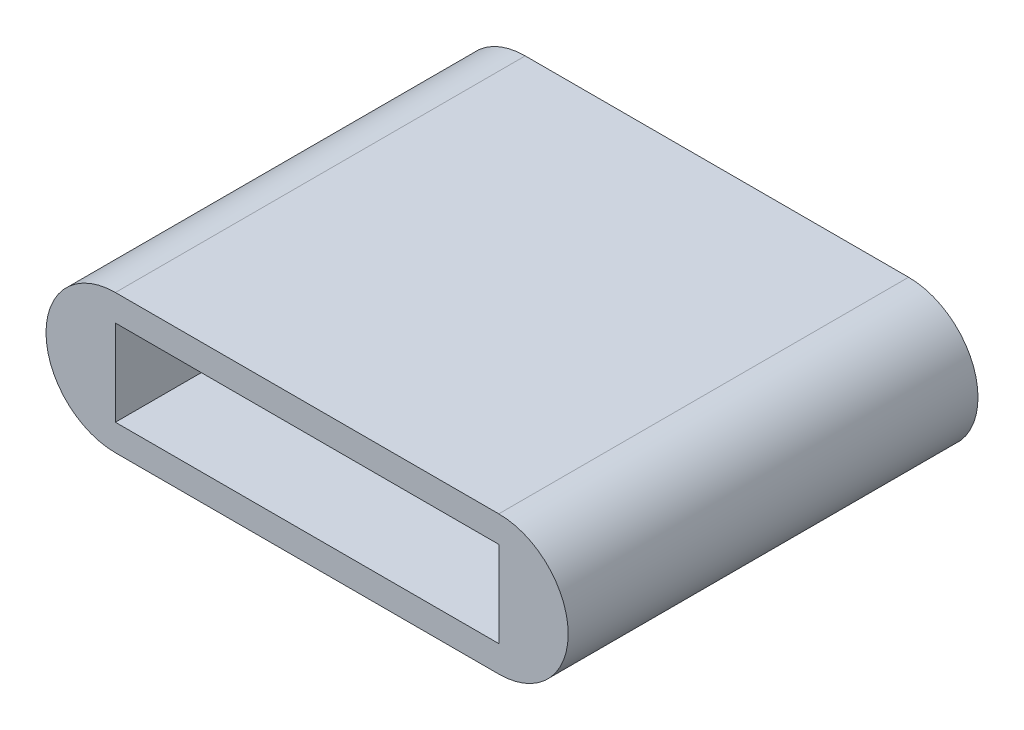
ISO-10303-21;
HEADER;
FILE_DESCRIPTION(('STEP AP214'),'2;1');
FILE_NAME('part.step','',(''),(''),'','','');
FILE_SCHEMA(('AUTOMOTIVE_DESIGN { 1 0 10303 214 1 1 1 1 }'));
ENDSEC;
DATA;
#1=APPLICATION_CONTEXT('core data for automotive mechanical design processes');
#2=APPLICATION_PROTOCOL_DEFINITION('international standard','automotive_design',2000,#1);
#3=PRODUCT_CONTEXT('',#1,'mechanical');
#4=PRODUCT('Part','Part','',(#3));
#5=PRODUCT_RELATED_PRODUCT_CATEGORY('part','',(#4));
#6=PRODUCT_DEFINITION_FORMATION('','',#4);
#7=PRODUCT_DEFINITION_CONTEXT('part definition',#1,'design');
#8=PRODUCT_DEFINITION('design','',#6,#7);
#9=PRODUCT_DEFINITION_SHAPE('','',#8);
#10=(LENGTH_UNIT() NAMED_UNIT(*) SI_UNIT(.MILLI.,.METRE.));
#11=(NAMED_UNIT(*) PLANE_ANGLE_UNIT() SI_UNIT($,.RADIAN.));
#12=(NAMED_UNIT(*) SI_UNIT($,.STERADIAN.) SOLID_ANGLE_UNIT());
#13=UNCERTAINTY_MEASURE_WITH_UNIT(LENGTH_MEASURE(1.E-05),#10,'distance_accuracy_value','');
#14=(GEOMETRIC_REPRESENTATION_CONTEXT(3) GLOBAL_UNCERTAINTY_ASSIGNED_CONTEXT((#13)) GLOBAL_UNIT_ASSIGNED_CONTEXT((#10,
#11,#12)) REPRESENTATION_CONTEXT('',''));
#15=CARTESIAN_POINT('',(0.,0.,0.));
#16=DIRECTION('',(0.,0.,1.));
#17=DIRECTION('',(1.,0.,0.));
#18=AXIS2_PLACEMENT_3D('',#15,#16,#17);
#19=CARTESIAN_POINT('',(-2.9,0.,-3.05));
#20=DIRECTION('',(0.,0.,1.));
#21=DIRECTION('',(1.,0.,0.));
#22=AXIS2_PLACEMENT_3D('',#19,#20,#21);
#23=CYLINDRICAL_SURFACE('',#22,1.05);
#24=CARTESIAN_POINT('',(-2.9,0.,-3.05));
#25=DIRECTION('',(0.,0.,1.));
#26=DIRECTION('',(1.,0.,0.));
#27=AXIS2_PLACEMENT_3D('',#24,#25,#26);
#28=CIRCLE('',#27,1.05);
#29=CARTESIAN_POINT('',(-2.9,1.05,-3.05));
#30=VERTEX_POINT('',#29);
#31=CARTESIAN_POINT('',(-2.9,-1.05,-3.05));
#32=VERTEX_POINT('',#31);
#33=EDGE_CURVE('E101',#30,#32,#28,.T.);
#34=ORIENTED_EDGE('',*,*,#33,.T.);
#35=DIRECTION('',(0.,0.,1.));
#36=VECTOR('',#35,1.);
#37=CARTESIAN_POINT('',(-2.9,-1.05,-3.05));
#38=LINE('',#37,#36);
#39=CARTESIAN_POINT('',(-2.9,-1.05,3.15));
#40=VERTEX_POINT('',#39);
#41=EDGE_CURVE('E113',#40,#32,#38,.F.);
#42=ORIENTED_EDGE('',*,*,#41,.F.);
#43=CARTESIAN_POINT('',(-2.9,0.,3.15));
#44=DIRECTION('',(0.,0.,1.));
#45=DIRECTION('',(1.,0.,0.));
#46=AXIS2_PLACEMENT_3D('',#43,#44,#45);
#47=CIRCLE('',#46,1.05);
#48=CARTESIAN_POINT('',(-2.9,1.05,3.15));
#49=VERTEX_POINT('',#48);
#50=EDGE_CURVE('E118',#49,#40,#47,.T.);
#51=ORIENTED_EDGE('',*,*,#50,.F.);
#52=DIRECTION('',(0.,0.,1.));
#53=VECTOR('',#52,1.);
#54=CARTESIAN_POINT('',(-2.9,1.05,-3.05));
#55=LINE('',#54,#53);
#56=EDGE_CURVE('E93',#30,#49,#55,.T.);
#57=ORIENTED_EDGE('',*,*,#56,.F.);
#58=EDGE_LOOP('',(#34,#42,#51,#57));
#59=FACE_BOUND('',#58,.T.);
#60=ADVANCED_FACE('F17',(#59),#23,.T.);
#61=CARTESIAN_POINT('',(-2.9,-1.05,-3.05));
#62=DIRECTION('',(0.,-1.,0.));
#63=DIRECTION('',(1.,0.,0.));
#64=AXIS2_PLACEMENT_3D('',#61,#62,#63);
#65=PLANE('',#64);
#66=DIRECTION('',(1.,0.,0.));
#67=VECTOR('',#66,1.);
#68=CARTESIAN_POINT('',(0.,-1.05,-3.05));
#69=LINE('',#68,#67);
#70=CARTESIAN_POINT('',(2.9,-1.05,-3.05));
#71=VERTEX_POINT('',#70);
#72=EDGE_CURVE('E120',#32,#71,#69,.T.);
#73=ORIENTED_EDGE('',*,*,#72,.T.);
#74=DIRECTION('',(0.,0.,1.));
#75=VECTOR('',#74,1.);
#76=CARTESIAN_POINT('',(2.9,-1.05,-3.05));
#77=LINE('',#76,#75);
#78=CARTESIAN_POINT('',(2.9,-1.05,3.15));
#79=VERTEX_POINT('',#78);
#80=EDGE_CURVE('E80',#79,#71,#77,.F.);
#81=ORIENTED_EDGE('',*,*,#80,.F.);
#82=DIRECTION('',(1.,0.,0.));
#83=VECTOR('',#82,1.);
#84=CARTESIAN_POINT('',(0.,-1.05,3.15));
#85=LINE('',#84,#83);
#86=EDGE_CURVE('E117',#40,#79,#85,.T.);
#87=ORIENTED_EDGE('',*,*,#86,.F.);
#88=ORIENTED_EDGE('',*,*,#41,.T.);
#89=EDGE_LOOP('',(#73,#81,#87,#88));
#90=FACE_BOUND('',#89,.T.);
#91=ADVANCED_FACE('F166',(#90),#65,.T.);
#92=CARTESIAN_POINT('',(2.9,0.,-3.05));
#93=DIRECTION('',(0.,0.,1.));
#94=DIRECTION('',(1.,0.,0.));
#95=AXIS2_PLACEMENT_3D('',#92,#93,#94);
#96=CYLINDRICAL_SURFACE('',#95,1.05);
#97=CARTESIAN_POINT('',(2.9,0.,-3.05));
#98=DIRECTION('',(0.,0.,1.));
#99=DIRECTION('',(1.,0.,0.));
#100=AXIS2_PLACEMENT_3D('',#97,#98,#99);
#101=CIRCLE('',#100,1.05);
#102=CARTESIAN_POINT('',(2.9,1.05,-3.05));
#103=VERTEX_POINT('',#102);
#104=EDGE_CURVE('E20',#71,#103,#101,.T.);
#105=ORIENTED_EDGE('',*,*,#104,.T.);
#106=DIRECTION('',(0.,0.,1.));
#107=VECTOR('',#106,1.);
#108=CARTESIAN_POINT('',(2.9,1.05,-3.05));
#109=LINE('',#108,#107);
#110=CARTESIAN_POINT('',(2.9,1.05,3.15));
#111=VERTEX_POINT('',#110);
#112=EDGE_CURVE('E87',#111,#103,#109,.F.);
#113=ORIENTED_EDGE('',*,*,#112,.F.);
#114=CARTESIAN_POINT('',(2.9,0.,3.15));
#115=DIRECTION('',(0.,0.,1.));
#116=DIRECTION('',(1.,0.,0.));
#117=AXIS2_PLACEMENT_3D('',#114,#115,#116);
#118=CIRCLE('',#117,1.05);
#119=EDGE_CURVE('E115',#79,#111,#118,.T.);
#120=ORIENTED_EDGE('',*,*,#119,.F.);
#121=ORIENTED_EDGE('',*,*,#80,.T.);
#122=EDGE_LOOP('',(#105,#113,#120,#121));
#123=FACE_BOUND('',#122,.T.);
#124=ADVANCED_FACE('F103',(#123),#96,.T.);
#125=CARTESIAN_POINT('',(2.9,1.05,-3.05));
#126=DIRECTION('',(0.,1.,0.));
#127=DIRECTION('',(-1.,0.,0.));
#128=AXIS2_PLACEMENT_3D('',#125,#126,#127);
#129=PLANE('',#128);
#130=DIRECTION('',(1.,0.,0.));
#131=VECTOR('',#130,1.);
#132=CARTESIAN_POINT('',(0.,1.05,-3.05));
#133=LINE('',#132,#131);
#134=EDGE_CURVE('E90',#103,#30,#133,.F.);
#135=ORIENTED_EDGE('',*,*,#134,.T.);
#136=ORIENTED_EDGE('',*,*,#56,.T.);
#137=DIRECTION('',(1.,0.,0.));
#138=VECTOR('',#137,1.);
#139=CARTESIAN_POINT('',(0.,1.05,3.15));
#140=LINE('',#139,#138);
#141=EDGE_CURVE('E92',#111,#49,#140,.F.);
#142=ORIENTED_EDGE('',*,*,#141,.F.);
#143=ORIENTED_EDGE('',*,*,#112,.T.);
#144=EDGE_LOOP('',(#135,#136,#142,#143));
#145=FACE_BOUND('',#144,.T.);
#146=ADVANCED_FACE('F89',(#145),#129,.T.);
#147=CARTESIAN_POINT('',(-2.9,-0.65,-3.05));
#148=DIRECTION('',(0.,-1.,0.));
#149=DIRECTION('',(1.,0.,0.));
#150=AXIS2_PLACEMENT_3D('',#147,#148,#149);
#151=PLANE('',#150);
#152=DIRECTION('',(0.,0.,1.));
#153=VECTOR('',#152,1.);
#154=CARTESIAN_POINT('',(2.90000000001746,-0.65,-3.05));
#155=LINE('',#154,#153);
#156=CARTESIAN_POINT('',(2.90000000001746,-0.65,3.15));
#157=VERTEX_POINT('',#156);
#158=CARTESIAN_POINT('',(2.90000000001746,-0.65,-3.05));
#159=VERTEX_POINT('',#158);
#160=EDGE_CURVE('E104',#157,#159,#155,.F.);
#161=ORIENTED_EDGE('',*,*,#160,.T.);
#162=DIRECTION('',(1.,0.,0.));
#163=VECTOR('',#162,1.);
#164=CARTESIAN_POINT('',(0.,-0.65,-3.05));
#165=LINE('',#164,#163);
#166=CARTESIAN_POINT('',(-2.9,-0.65,-3.05));
#167=VERTEX_POINT('',#166);
#168=EDGE_CURVE('E126',#159,#167,#165,.F.);
#169=ORIENTED_EDGE('',*,*,#168,.T.);
#170=DIRECTION('',(0.,0.,1.));
#171=VECTOR('',#170,1.);
#172=CARTESIAN_POINT('',(-2.9,-0.65,-3.05));
#173=LINE('',#172,#171);
#174=CARTESIAN_POINT('',(-2.9,-0.65,3.15));
#175=VERTEX_POINT('',#174);
#176=EDGE_CURVE('E119',#167,#175,#173,.T.);
#177=ORIENTED_EDGE('',*,*,#176,.T.);
#178=DIRECTION('',(1.,0.,0.));
#179=VECTOR('',#178,1.);
#180=CARTESIAN_POINT('',(0.,-0.65,3.15));
#181=LINE('',#180,#179);
#182=EDGE_CURVE('E140',#157,#175,#181,.F.);
#183=ORIENTED_EDGE('',*,*,#182,.F.);
#184=EDGE_LOOP('',(#161,#169,#177,#183));
#185=FACE_BOUND('',#184,.T.);
#186=ADVANCED_FACE('F185',(#185),#151,.F.);
#187=CARTESIAN_POINT('',(2.90000000001746,-0.65,-3.05));
#188=DIRECTION('',(1.,0.,0.));
#189=DIRECTION('',(0.,1.,0.));
#190=AXIS2_PLACEMENT_3D('',#187,#188,#189);
#191=PLANE('',#190);
#192=DIRECTION('',(0.,0.,1.));
#193=VECTOR('',#192,1.);
#194=CARTESIAN_POINT('',(2.90000000001746,0.65,-3.05));
#195=LINE('',#194,#193);
#196=CARTESIAN_POINT('',(2.90000000001746,0.65,3.15));
#197=VERTEX_POINT('',#196);
#198=CARTESIAN_POINT('',(2.90000000001746,0.65,-3.05));
#199=VERTEX_POINT('',#198);
#200=EDGE_CURVE('E142',#197,#199,#195,.F.);
#201=ORIENTED_EDGE('',*,*,#200,.T.);
#202=DIRECTION('',(0.,1.,0.));
#203=VECTOR('',#202,1.);
#204=CARTESIAN_POINT('',(2.90000000001746,0.,-3.05));
#205=LINE('',#204,#203);
#206=EDGE_CURVE('E123',#199,#159,#205,.F.);
#207=ORIENTED_EDGE('',*,*,#206,.T.);
#208=ORIENTED_EDGE('',*,*,#160,.F.);
#209=DIRECTION('',(0.,1.,0.));
#210=VECTOR('',#209,1.);
#211=CARTESIAN_POINT('',(2.90000000001746,0.,3.15));
#212=LINE('',#211,#210);
#213=EDGE_CURVE('E137',#197,#157,#212,.F.);
#214=ORIENTED_EDGE('',*,*,#213,.F.);
#215=EDGE_LOOP('',(#201,#207,#208,#214));
#216=FACE_BOUND('',#215,.T.);
#217=ADVANCED_FACE('F158',(#216),#191,.F.);
#218=CARTESIAN_POINT('',(0.,0.,-3.05));
#219=DIRECTION('',(0.,0.,1.));
#220=DIRECTION('',(1.,0.,0.));
#221=AXIS2_PLACEMENT_3D('',#218,#219,#220);
#222=PLANE('',#221);
#223=ORIENTED_EDGE('',*,*,#168,.F.);
#224=ORIENTED_EDGE('',*,*,#206,.F.);
#225=DIRECTION('',(-1.,0.,0.));
#226=VECTOR('',#225,1.);
#227=CARTESIAN_POINT('',(2.90000000001746,0.65,-3.05));
#228=LINE('',#227,#226);
#229=CARTESIAN_POINT('',(-2.9,0.65,-3.05));
#230=VERTEX_POINT('',#229);
#231=EDGE_CURVE('E145',#199,#230,#228,.T.);
#232=ORIENTED_EDGE('',*,*,#231,.T.);
#233=DIRECTION('',(0.,-1.,0.));
#234=VECTOR('',#233,1.);
#235=CARTESIAN_POINT('',(-2.9,0.65,-3.05));
#236=LINE('',#235,#234);
#237=EDGE_CURVE('E130',#230,#167,#236,.T.);
#238=ORIENTED_EDGE('',*,*,#237,.T.);
#239=EDGE_LOOP('',(#223,#224,#232,#238));
#240=FACE_BOUND('',#239,.T.);
#241=ORIENTED_EDGE('',*,*,#33,.F.);
#242=ORIENTED_EDGE('',*,*,#134,.F.);
#243=ORIENTED_EDGE('',*,*,#104,.F.);
#244=ORIENTED_EDGE('',*,*,#72,.F.);
#245=EDGE_LOOP('',(#241,#242,#243,#244));
#246=FACE_BOUND('',#245,.T.);
#247=ADVANCED_FACE('F97',(#240,#246),#222,.F.);
#248=CARTESIAN_POINT('',(-2.9,0.65,-3.05));
#249=DIRECTION('',(-1.,0.,0.));
#250=DIRECTION('',(0.,-1.,0.));
#251=AXIS2_PLACEMENT_3D('',#248,#249,#250);
#252=PLANE('',#251);
#253=ORIENTED_EDGE('',*,*,#176,.F.);
#254=ORIENTED_EDGE('',*,*,#237,.F.);
#255=DIRECTION('',(0.,0.,1.));
#256=VECTOR('',#255,1.);
#257=CARTESIAN_POINT('',(-2.9,0.65,-3.05));
#258=LINE('',#257,#256);
#259=CARTESIAN_POINT('',(-2.9,0.65,3.15));
#260=VERTEX_POINT('',#259);
#261=EDGE_CURVE('E26',#230,#260,#258,.T.);
#262=ORIENTED_EDGE('',*,*,#261,.T.);
#263=DIRECTION('',(0.,1.,0.));
#264=VECTOR('',#263,1.);
#265=CARTESIAN_POINT('',(-2.9,0.,3.15));
#266=LINE('',#265,#264);
#267=EDGE_CURVE('E34',#175,#260,#266,.T.);
#268=ORIENTED_EDGE('',*,*,#267,.F.);
#269=EDGE_LOOP('',(#253,#254,#262,#268));
#270=FACE_BOUND('',#269,.T.);
#271=ADVANCED_FACE('F152',(#270),#252,.F.);
#272=CARTESIAN_POINT('',(0.,0.,3.15));
#273=DIRECTION('',(0.,0.,1.));
#274=DIRECTION('',(1.,0.,0.));
#275=AXIS2_PLACEMENT_3D('',#272,#273,#274);
#276=PLANE('',#275);
#277=ORIENTED_EDGE('',*,*,#213,.T.);
#278=ORIENTED_EDGE('',*,*,#182,.T.);
#279=ORIENTED_EDGE('',*,*,#267,.T.);
#280=DIRECTION('',(-1.,0.,0.));
#281=VECTOR('',#280,1.);
#282=CARTESIAN_POINT('',(2.90000000001746,0.65,3.15));
#283=LINE('',#282,#281);
#284=EDGE_CURVE('E11',#260,#197,#283,.F.);
#285=ORIENTED_EDGE('',*,*,#284,.T.);
#286=EDGE_LOOP('',(#277,#278,#279,#285));
#287=FACE_BOUND('',#286,.T.);
#288=ORIENTED_EDGE('',*,*,#119,.T.);
#289=ORIENTED_EDGE('',*,*,#141,.T.);
#290=ORIENTED_EDGE('',*,*,#50,.T.);
#291=ORIENTED_EDGE('',*,*,#86,.T.);
#292=EDGE_LOOP('',(#288,#289,#290,#291));
#293=FACE_BOUND('',#292,.T.);
#294=ADVANCED_FACE('F160',(#287,#293),#276,.T.);
#295=CARTESIAN_POINT('',(2.90000000001746,0.65,-3.05));
#296=DIRECTION('',(0.,1.,0.));
#297=DIRECTION('',(-1.,0.,0.));
#298=AXIS2_PLACEMENT_3D('',#295,#296,#297);
#299=PLANE('',#298);
#300=ORIENTED_EDGE('',*,*,#261,.F.);
#301=ORIENTED_EDGE('',*,*,#231,.F.);
#302=ORIENTED_EDGE('',*,*,#200,.F.);
#303=ORIENTED_EDGE('',*,*,#284,.F.);
#304=EDGE_LOOP('',(#300,#301,#302,#303));
#305=FACE_BOUND('',#304,.T.);
#306=ADVANCED_FACE('F155',(#305),#299,.F.);
#307=CLOSED_SHELL('',(#60,#91,#124,#146,#186,#217,#247,#271,#294,#306));
#308=MANIFOLD_SOLID_BREP('B1',#307);
#309=ADVANCED_BREP_SHAPE_REPRESENTATION('',(#18,#308),#14);
#310=SHAPE_DEFINITION_REPRESENTATION(#9,#309);
ENDSEC;
END-ISO-10303-21;
